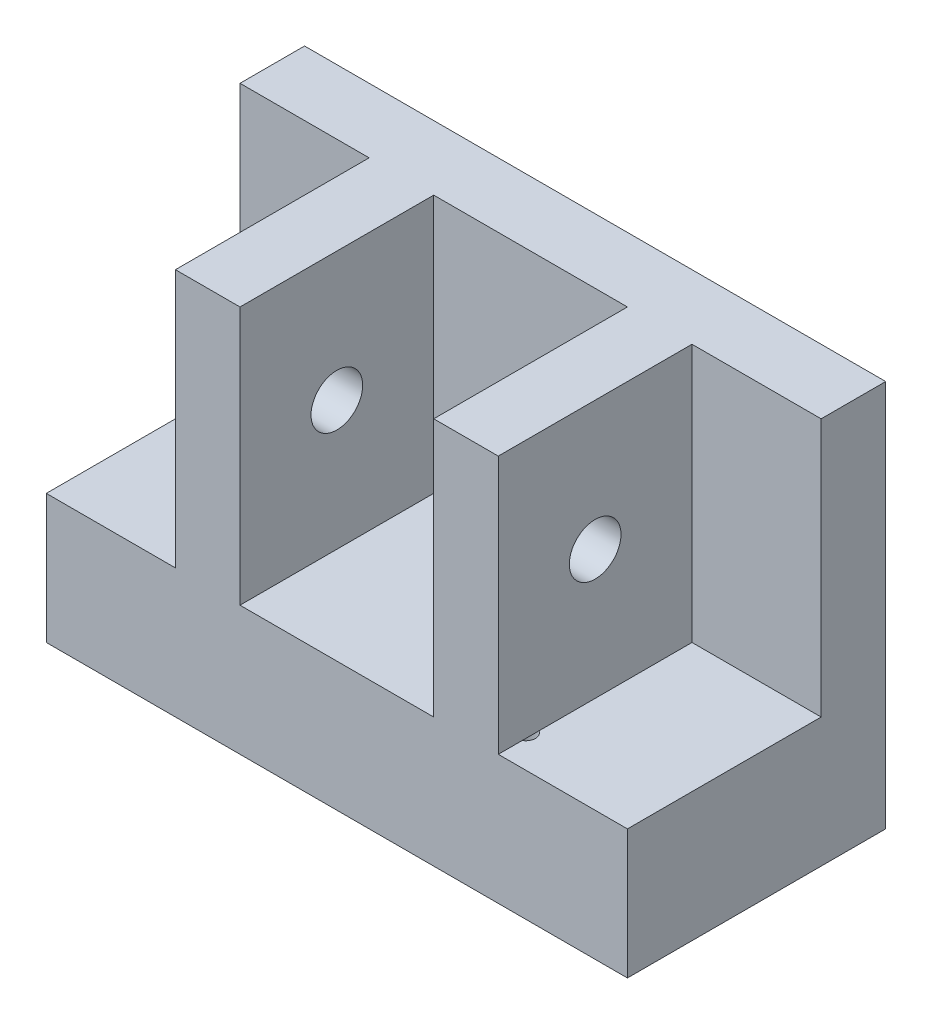
ISO-10303-21;
HEADER;
FILE_DESCRIPTION(('STEP AP214'),'2;1');
FILE_NAME('part.step','',(''),(''),'','','');
FILE_SCHEMA(('AUTOMOTIVE_DESIGN { 1 0 10303 214 1 1 1 1 }'));
ENDSEC;
DATA;
#1=APPLICATION_CONTEXT('core data for automotive mechanical design processes');
#2=APPLICATION_PROTOCOL_DEFINITION('international standard','automotive_design',2000,#1);
#3=PRODUCT_CONTEXT('',#1,'mechanical');
#4=PRODUCT('Part','Part','',(#3));
#5=PRODUCT_RELATED_PRODUCT_CATEGORY('part','',(#4));
#6=PRODUCT_DEFINITION_FORMATION('','',#4);
#7=PRODUCT_DEFINITION_CONTEXT('part definition',#1,'design');
#8=PRODUCT_DEFINITION('design','',#6,#7);
#9=PRODUCT_DEFINITION_SHAPE('','',#8);
#10=(LENGTH_UNIT() NAMED_UNIT(*) SI_UNIT(.MILLI.,.METRE.));
#11=(NAMED_UNIT(*) PLANE_ANGLE_UNIT() SI_UNIT($,.RADIAN.));
#12=(NAMED_UNIT(*) SI_UNIT($,.STERADIAN.) SOLID_ANGLE_UNIT());
#13=UNCERTAINTY_MEASURE_WITH_UNIT(LENGTH_MEASURE(1.E-05),#10,'distance_accuracy_value','');
#14=(GEOMETRIC_REPRESENTATION_CONTEXT(3) GLOBAL_UNCERTAINTY_ASSIGNED_CONTEXT((#13)) GLOBAL_UNIT_ASSIGNED_CONTEXT((#10,
#11,#12)) REPRESENTATION_CONTEXT('',''));
#15=CARTESIAN_POINT('',(0.,0.,0.));
#16=DIRECTION('',(0.,0.,1.));
#17=DIRECTION('',(1.,0.,0.));
#18=AXIS2_PLACEMENT_3D('',#15,#16,#17);
#19=CARTESIAN_POINT('',(0.,40.,-30.));
#20=DIRECTION('',(0.,0.,1.));
#21=DIRECTION('',(1.,0.,0.));
#22=AXIS2_PLACEMENT_3D('',#19,#20,#21);
#23=PLANE('',#22);
#24=DIRECTION('',(-1.,0.,0.));
#25=VECTOR('',#24,1.);
#26=CARTESIAN_POINT('',(0.,0.,-30.));
#27=LINE('',#26,#25);
#28=CARTESIAN_POINT('',(-25.,0.,-30.));
#29=VERTEX_POINT('',#28);
#30=CARTESIAN_POINT('',(-45.,0.,-30.));
#31=VERTEX_POINT('',#30);
#32=EDGE_CURVE('E175',#29,#31,#27,.T.);
#33=ORIENTED_EDGE('',*,*,#32,.F.);
#34=DIRECTION('',(0.,-1.,0.));
#35=VECTOR('',#34,1.);
#36=CARTESIAN_POINT('',(-25.,40.,-30.));
#37=LINE('',#36,#35);
#38=CARTESIAN_POINT('',(-25.,40.,-30.));
#39=VERTEX_POINT('',#38);
#40=EDGE_CURVE('E11',#39,#29,#37,.T.);
#41=ORIENTED_EDGE('',*,*,#40,.F.);
#42=DIRECTION('',(-1.,0.,0.));
#43=VECTOR('',#42,1.);
#44=CARTESIAN_POINT('',(0.,40.,-30.));
#45=LINE('',#44,#43);
#46=CARTESIAN_POINT('',(-45.,40.,-30.));
#47=VERTEX_POINT('',#46);
#48=EDGE_CURVE('E199',#39,#47,#45,.T.);
#49=ORIENTED_EDGE('',*,*,#48,.T.);
#50=DIRECTION('',(0.,-1.,0.));
#51=VECTOR('',#50,1.);
#52=CARTESIAN_POINT('',(-45.,40.,-30.));
#53=LINE('',#52,#51);
#54=EDGE_CURVE('E200',#47,#31,#53,.T.);
#55=ORIENTED_EDGE('',*,*,#54,.T.);
#56=EDGE_LOOP('',(#33,#41,#49,#55));
#57=FACE_BOUND('',#56,.T.);
#58=ADVANCED_FACE('F43',(#57),#23,.T.);
#59=CARTESIAN_POINT('',(-25.,40.,0.));
#60=DIRECTION('',(1.,0.,0.));
#61=DIRECTION('',(0.,0.,-1.));
#62=AXIS2_PLACEMENT_3D('',#59,#60,#61);
#63=PLANE('',#62);
#64=CARTESIAN_POINT('',(-25.,20.,-15.));
#65=DIRECTION('',(1.,0.,0.));
#66=DIRECTION('',(0.,0.,-1.));
#67=AXIS2_PLACEMENT_3D('',#64,#65,#66);
#68=CIRCLE('',#67,4.);
#69=CARTESIAN_POINT('',(-25.,20.,-19.));
#70=VERTEX_POINT('',#69);
#71=EDGE_CURVE('E250',#70,#70,#68,.T.);
#72=ORIENTED_EDGE('',*,*,#71,.T.);
#73=EDGE_LOOP('',(#72));
#74=FACE_BOUND('',#73,.T.);
#75=DIRECTION('',(0.,0.,1.));
#76=VECTOR('',#75,1.);
#77=CARTESIAN_POINT('',(-25.,0.,0.));
#78=LINE('',#77,#76);
#79=CARTESIAN_POINT('',(-25.,0.,-6.29903810567667));
#80=VERTEX_POINT('',#79);
#81=EDGE_CURVE('E177',#29,#80,#78,.T.);
#82=ORIENTED_EDGE('',*,*,#81,.T.);
#83=CARTESIAN_POINT('',(-25.,0.,-3.70096189432335));
#84=VERTEX_POINT('',#83);
#85=EDGE_CURVE('E156',#80,#84,#78,.T.);
#86=ORIENTED_EDGE('',*,*,#85,.T.);
#87=CARTESIAN_POINT('',(-25.,0.,0.));
#88=VERTEX_POINT('',#87);
#89=EDGE_CURVE('E168',#84,#88,#78,.T.);
#90=ORIENTED_EDGE('',*,*,#89,.T.);
#91=DIRECTION('',(0.,-1.,0.));
#92=VECTOR('',#91,1.);
#93=CARTESIAN_POINT('',(-25.,40.,0.));
#94=LINE('',#93,#92);
#95=CARTESIAN_POINT('',(-25.,40.,0.));
#96=VERTEX_POINT('',#95);
#97=EDGE_CURVE('E51',#96,#88,#94,.T.);
#98=ORIENTED_EDGE('',*,*,#97,.F.);
#99=DIRECTION('',(0.,0.,1.));
#100=VECTOR('',#99,1.);
#101=CARTESIAN_POINT('',(-25.,40.,0.));
#102=LINE('',#101,#100);
#103=EDGE_CURVE('E237',#39,#96,#102,.T.);
#104=ORIENTED_EDGE('',*,*,#103,.F.);
#105=ORIENTED_EDGE('',*,*,#40,.T.);
#106=EDGE_LOOP('',(#82,#86,#90,#98,#104,#105));
#107=FACE_BOUND('',#106,.T.);
#108=ADVANCED_FACE('F178',(#74,#107),#63,.F.);
#109=CARTESIAN_POINT('',(-15.,40.,0.));
#110=DIRECTION('',(-1.,0.,0.));
#111=DIRECTION('',(0.,0.,1.));
#112=AXIS2_PLACEMENT_3D('',#109,#110,#111);
#113=PLANE('',#112);
#114=CARTESIAN_POINT('',(-15.,20.,-15.));
#115=DIRECTION('',(-1.,0.,0.));
#116=DIRECTION('',(0.,0.,1.));
#117=AXIS2_PLACEMENT_3D('',#114,#115,#116);
#118=CIRCLE('',#117,4.);
#119=CARTESIAN_POINT('',(-15.,20.,-11.));
#120=VERTEX_POINT('',#119);
#121=EDGE_CURVE('E276',#120,#120,#118,.T.);
#122=ORIENTED_EDGE('',*,*,#121,.T.);
#123=EDGE_LOOP('',(#122));
#124=FACE_BOUND('',#123,.T.);
#125=DIRECTION('',(0.,0.,-1.));
#126=VECTOR('',#125,1.);
#127=CARTESIAN_POINT('',(-15.,0.,0.));
#128=LINE('',#127,#126);
#129=CARTESIAN_POINT('',(-15.,0.,0.));
#130=VERTEX_POINT('',#129);
#131=CARTESIAN_POINT('',(-15.,0.,-30.));
#132=VERTEX_POINT('',#131);
#133=EDGE_CURVE('E179',#130,#132,#128,.T.);
#134=ORIENTED_EDGE('',*,*,#133,.T.);
#135=DIRECTION('',(0.,-1.,0.));
#136=VECTOR('',#135,1.);
#137=CARTESIAN_POINT('',(-15.,40.,-30.));
#138=LINE('',#137,#136);
#139=CARTESIAN_POINT('',(-15.,40.,-30.));
#140=VERTEX_POINT('',#139);
#141=EDGE_CURVE('E223',#140,#132,#138,.T.);
#142=ORIENTED_EDGE('',*,*,#141,.F.);
#143=DIRECTION('',(0.,0.,-1.));
#144=VECTOR('',#143,1.);
#145=CARTESIAN_POINT('',(-15.,40.,0.));
#146=LINE('',#145,#144);
#147=CARTESIAN_POINT('',(-15.,40.,0.));
#148=VERTEX_POINT('',#147);
#149=EDGE_CURVE('E254',#148,#140,#146,.T.);
#150=ORIENTED_EDGE('',*,*,#149,.F.);
#151=DIRECTION('',(0.,-1.,0.));
#152=VECTOR('',#151,1.);
#153=CARTESIAN_POINT('',(-15.,40.,0.));
#154=LINE('',#153,#152);
#155=EDGE_CURVE('E226',#148,#130,#154,.T.);
#156=ORIENTED_EDGE('',*,*,#155,.T.);
#157=EDGE_LOOP('',(#134,#142,#150,#156));
#158=FACE_BOUND('',#157,.T.);
#159=ADVANCED_FACE('F353',(#124,#158),#113,.F.);
#160=CARTESIAN_POINT('',(0.,40.,-30.));
#161=DIRECTION('',(0.,0.,-1.));
#162=DIRECTION('',(-1.,0.,0.));
#163=AXIS2_PLACEMENT_3D('',#160,#161,#162);
#164=PLANE('',#163);
#165=DIRECTION('',(1.,0.,0.));
#166=VECTOR('',#165,1.);
#167=CARTESIAN_POINT('',(0.,0.,-30.));
#168=LINE('',#167,#166);
#169=CARTESIAN_POINT('',(15.,0.,-30.));
#170=VERTEX_POINT('',#169);
#171=EDGE_CURVE('E185',#132,#170,#168,.T.);
#172=ORIENTED_EDGE('',*,*,#171,.T.);
#173=DIRECTION('',(0.,-1.,0.));
#174=VECTOR('',#173,1.);
#175=CARTESIAN_POINT('',(15.,40.,-30.));
#176=LINE('',#175,#174);
#177=CARTESIAN_POINT('',(15.,40.,-30.));
#178=VERTEX_POINT('',#177);
#179=EDGE_CURVE('E220',#178,#170,#176,.T.);
#180=ORIENTED_EDGE('',*,*,#179,.F.);
#181=DIRECTION('',(1.,0.,0.));
#182=VECTOR('',#181,1.);
#183=CARTESIAN_POINT('',(0.,40.,-30.));
#184=LINE('',#183,#182);
#185=EDGE_CURVE('E256',#140,#178,#184,.T.);
#186=ORIENTED_EDGE('',*,*,#185,.F.);
#187=ORIENTED_EDGE('',*,*,#141,.T.);
#188=EDGE_LOOP('',(#172,#180,#186,#187));
#189=FACE_BOUND('',#188,.T.);
#190=ADVANCED_FACE('F349',(#189),#164,.F.);
#191=CARTESIAN_POINT('',(15.,40.,0.));
#192=DIRECTION('',(1.,0.,0.));
#193=DIRECTION('',(0.,0.,-1.));
#194=AXIS2_PLACEMENT_3D('',#191,#192,#193);
#195=PLANE('',#194);
#196=CARTESIAN_POINT('',(15.,20.,-15.));
#197=DIRECTION('',(1.,0.,0.));
#198=DIRECTION('',(0.,0.,-1.));
#199=AXIS2_PLACEMENT_3D('',#196,#197,#198);
#200=CIRCLE('',#199,4.);
#201=CARTESIAN_POINT('',(15.,20.,-19.));
#202=VERTEX_POINT('',#201);
#203=EDGE_CURVE('E280',#202,#202,#200,.T.);
#204=ORIENTED_EDGE('',*,*,#203,.T.);
#205=EDGE_LOOP('',(#204));
#206=FACE_BOUND('',#205,.T.);
#207=DIRECTION('',(0.,0.,1.));
#208=VECTOR('',#207,1.);
#209=CARTESIAN_POINT('',(15.,0.,0.));
#210=LINE('',#209,#208);
#211=CARTESIAN_POINT('',(15.,0.,0.));
#212=VERTEX_POINT('',#211);
#213=EDGE_CURVE('E188',#170,#212,#210,.T.);
#214=ORIENTED_EDGE('',*,*,#213,.T.);
#215=DIRECTION('',(0.,-1.,0.));
#216=VECTOR('',#215,1.);
#217=CARTESIAN_POINT('',(15.,40.,0.));
#218=LINE('',#217,#216);
#219=CARTESIAN_POINT('',(15.,40.,0.));
#220=VERTEX_POINT('',#219);
#221=EDGE_CURVE('E217',#220,#212,#218,.T.);
#222=ORIENTED_EDGE('',*,*,#221,.F.);
#223=DIRECTION('',(0.,0.,1.));
#224=VECTOR('',#223,1.);
#225=CARTESIAN_POINT('',(15.,40.,0.));
#226=LINE('',#225,#224);
#227=EDGE_CURVE('E258',#178,#220,#226,.T.);
#228=ORIENTED_EDGE('',*,*,#227,.F.);
#229=ORIENTED_EDGE('',*,*,#179,.T.);
#230=EDGE_LOOP('',(#214,#222,#228,#229));
#231=FACE_BOUND('',#230,.T.);
#232=ADVANCED_FACE('F346',(#206,#231),#195,.F.);
#233=CARTESIAN_POINT('',(0.,40.,0.));
#234=DIRECTION('',(0.,0.,-1.));
#235=DIRECTION('',(-1.,0.,0.));
#236=AXIS2_PLACEMENT_3D('',#233,#234,#235);
#237=PLANE('',#236);
#238=ORIENTED_EDGE('',*,*,#221,.T.);
#239=DIRECTION('',(-1.,0.,0.));
#240=VECTOR('',#239,1.);
#241=CARTESIAN_POINT('',(-45.,0.,0.));
#242=LINE('',#241,#240);
#243=EDGE_CURVE('E296',#212,#130,#242,.T.);
#244=ORIENTED_EDGE('',*,*,#243,.T.);
#245=ORIENTED_EDGE('',*,*,#155,.F.);
#246=DIRECTION('',(1.,0.,0.));
#247=VECTOR('',#246,1.);
#248=CARTESIAN_POINT('',(0.,40.,0.));
#249=LINE('',#248,#247);
#250=EDGE_CURVE('E235',#96,#148,#249,.T.);
#251=ORIENTED_EDGE('',*,*,#250,.F.);
#252=ORIENTED_EDGE('',*,*,#97,.T.);
#253=CARTESIAN_POINT('',(-45.,0.,0.));
#254=VERTEX_POINT('',#253);
#255=EDGE_CURVE('E171',#88,#254,#242,.T.);
#256=ORIENTED_EDGE('',*,*,#255,.T.);
#257=DIRECTION('',(0.,1.,0.));
#258=VECTOR('',#257,1.);
#259=CARTESIAN_POINT('',(-45.,-20.,0.));
#260=LINE('',#259,#258);
#261=CARTESIAN_POINT('',(-45.,-20.,0.));
#262=VERTEX_POINT('',#261);
#263=EDGE_CURVE('E289',#262,#254,#260,.T.);
#264=ORIENTED_EDGE('',*,*,#263,.F.);
#265=DIRECTION('',(-1.,0.,0.));
#266=VECTOR('',#265,1.);
#267=CARTESIAN_POINT('',(-45.,-20.,0.));
#268=LINE('',#267,#266);
#269=CARTESIAN_POINT('',(45.,-20.,0.));
#270=VERTEX_POINT('',#269);
#271=EDGE_CURVE('E291',#270,#262,#268,.T.);
#272=ORIENTED_EDGE('',*,*,#271,.F.);
#273=DIRECTION('',(0.,1.,0.));
#274=VECTOR('',#273,1.);
#275=CARTESIAN_POINT('',(45.,-20.,0.));
#276=LINE('',#275,#274);
#277=CARTESIAN_POINT('',(45.,0.,0.));
#278=VERTEX_POINT('',#277);
#279=EDGE_CURVE('E286',#270,#278,#276,.T.);
#280=ORIENTED_EDGE('',*,*,#279,.T.);
#281=CARTESIAN_POINT('',(25.,0.,0.));
#282=VERTEX_POINT('',#281);
#283=EDGE_CURVE('E292',#278,#282,#242,.T.);
#284=ORIENTED_EDGE('',*,*,#283,.T.);
#285=DIRECTION('',(0.,-1.,0.));
#286=VECTOR('',#285,1.);
#287=CARTESIAN_POINT('',(25.,40.,0.));
#288=LINE('',#287,#286);
#289=CARTESIAN_POINT('',(25.,40.,0.));
#290=VERTEX_POINT('',#289);
#291=EDGE_CURVE('E214',#290,#282,#288,.T.);
#292=ORIENTED_EDGE('',*,*,#291,.F.);
#293=DIRECTION('',(1.,0.,0.));
#294=VECTOR('',#293,1.);
#295=CARTESIAN_POINT('',(0.,40.,0.));
#296=LINE('',#295,#294);
#297=EDGE_CURVE('E260',#220,#290,#296,.T.);
#298=ORIENTED_EDGE('',*,*,#297,.F.);
#299=EDGE_LOOP('',(#238,#244,#245,#251,#252,#256,#264,#272,#280,#284,#292,#298));
#300=FACE_BOUND('',#299,.T.);
#301=ADVANCED_FACE('F231',(#300),#237,.F.);
#302=CARTESIAN_POINT('',(25.,40.,0.));
#303=DIRECTION('',(-1.,0.,0.));
#304=DIRECTION('',(0.,0.,1.));
#305=AXIS2_PLACEMENT_3D('',#302,#303,#304);
#306=PLANE('',#305);
#307=CARTESIAN_POINT('',(25.,20.,-15.));
#308=DIRECTION('',(-1.,0.,0.));
#309=DIRECTION('',(0.,0.,1.));
#310=AXIS2_PLACEMENT_3D('',#307,#308,#309);
#311=CIRCLE('',#310,4.);
#312=CARTESIAN_POINT('',(25.,20.,-11.));
#313=VERTEX_POINT('',#312);
#314=EDGE_CURVE('E46',#313,#313,#311,.T.);
#315=ORIENTED_EDGE('',*,*,#314,.T.);
#316=EDGE_LOOP('',(#315));
#317=FACE_BOUND('',#316,.T.);
#318=DIRECTION('',(0.,0.,-1.));
#319=VECTOR('',#318,1.);
#320=CARTESIAN_POINT('',(25.,0.,0.));
#321=LINE('',#320,#319);
#322=CARTESIAN_POINT('',(25.,0.,-3.70096189432335));
#323=VERTEX_POINT('',#322);
#324=EDGE_CURVE('E192',#282,#323,#321,.T.);
#325=ORIENTED_EDGE('',*,*,#324,.T.);
#326=CARTESIAN_POINT('',(25.,0.,-6.29903810567666));
#327=VERTEX_POINT('',#326);
#328=EDGE_CURVE('E196',#323,#327,#321,.T.);
#329=ORIENTED_EDGE('',*,*,#328,.T.);
#330=CARTESIAN_POINT('',(25.,0.,-30.));
#331=VERTEX_POINT('',#330);
#332=EDGE_CURVE('E191',#327,#331,#321,.T.);
#333=ORIENTED_EDGE('',*,*,#332,.T.);
#334=DIRECTION('',(0.,-1.,0.));
#335=VECTOR('',#334,1.);
#336=CARTESIAN_POINT('',(25.,40.,-30.));
#337=LINE('',#336,#335);
#338=CARTESIAN_POINT('',(25.,40.,-30.));
#339=VERTEX_POINT('',#338);
#340=EDGE_CURVE('E211',#339,#331,#337,.T.);
#341=ORIENTED_EDGE('',*,*,#340,.F.);
#342=DIRECTION('',(0.,0.,-1.));
#343=VECTOR('',#342,1.);
#344=CARTESIAN_POINT('',(25.,40.,0.));
#345=LINE('',#344,#343);
#346=EDGE_CURVE('E262',#290,#339,#345,.T.);
#347=ORIENTED_EDGE('',*,*,#346,.F.);
#348=ORIENTED_EDGE('',*,*,#291,.T.);
#349=EDGE_LOOP('',(#325,#329,#333,#341,#347,#348));
#350=FACE_BOUND('',#349,.T.);
#351=ADVANCED_FACE('F336',(#317,#350),#306,.F.);
#352=CARTESIAN_POINT('',(0.,40.,-30.));
#353=DIRECTION('',(0.,0.,-1.));
#354=DIRECTION('',(-1.,0.,0.));
#355=AXIS2_PLACEMENT_3D('',#352,#353,#354);
#356=PLANE('',#355);
#357=DIRECTION('',(1.,0.,0.));
#358=VECTOR('',#357,1.);
#359=CARTESIAN_POINT('',(0.,0.,-30.));
#360=LINE('',#359,#358);
#361=CARTESIAN_POINT('',(45.,0.,-30.));
#362=VERTEX_POINT('',#361);
#363=EDGE_CURVE('E195',#331,#362,#360,.T.);
#364=ORIENTED_EDGE('',*,*,#363,.T.);
#365=DIRECTION('',(0.,-1.,0.));
#366=VECTOR('',#365,1.);
#367=CARTESIAN_POINT('',(45.,40.,-30.));
#368=LINE('',#367,#366);
#369=CARTESIAN_POINT('',(45.,40.,-30.));
#370=VERTEX_POINT('',#369);
#371=EDGE_CURVE('E208',#370,#362,#368,.T.);
#372=ORIENTED_EDGE('',*,*,#371,.F.);
#373=DIRECTION('',(1.,0.,0.));
#374=VECTOR('',#373,1.);
#375=CARTESIAN_POINT('',(0.,40.,-30.));
#376=LINE('',#375,#374);
#377=EDGE_CURVE('E264',#339,#370,#376,.T.);
#378=ORIENTED_EDGE('',*,*,#377,.F.);
#379=ORIENTED_EDGE('',*,*,#340,.T.);
#380=EDGE_LOOP('',(#364,#372,#378,#379));
#381=FACE_BOUND('',#380,.T.);
#382=ADVANCED_FACE('F437',(#381),#356,.F.);
#383=CARTESIAN_POINT('',(45.,40.,0.));
#384=DIRECTION('',(-1.,0.,0.));
#385=DIRECTION('',(0.,0.,1.));
#386=AXIS2_PLACEMENT_3D('',#383,#384,#385);
#387=PLANE('',#386);
#388=ORIENTED_EDGE('',*,*,#371,.T.);
#389=DIRECTION('',(0.,0.,1.));
#390=VECTOR('',#389,1.);
#391=CARTESIAN_POINT('',(45.,0.,-40.));
#392=LINE('',#391,#390);
#393=EDGE_CURVE('E297',#362,#278,#392,.T.);
#394=ORIENTED_EDGE('',*,*,#393,.T.);
#395=ORIENTED_EDGE('',*,*,#279,.F.);
#396=DIRECTION('',(0.,0.,1.));
#397=VECTOR('',#396,1.);
#398=CARTESIAN_POINT('',(45.,-20.,-40.));
#399=LINE('',#398,#397);
#400=CARTESIAN_POINT('',(45.,-20.,-40.));
#401=VERTEX_POINT('',#400);
#402=EDGE_CURVE('E301',#401,#270,#399,.T.);
#403=ORIENTED_EDGE('',*,*,#402,.F.);
#404=DIRECTION('',(0.,-1.,0.));
#405=VECTOR('',#404,1.);
#406=CARTESIAN_POINT('',(45.,40.,-40.));
#407=LINE('',#406,#405);
#408=CARTESIAN_POINT('',(45.,40.,-40.));
#409=VERTEX_POINT('',#408);
#410=EDGE_CURVE('E206',#409,#401,#407,.T.);
#411=ORIENTED_EDGE('',*,*,#410,.F.);
#412=DIRECTION('',(0.,0.,-1.));
#413=VECTOR('',#412,1.);
#414=CARTESIAN_POINT('',(45.,40.,0.));
#415=LINE('',#414,#413);
#416=EDGE_CURVE('E266',#370,#409,#415,.T.);
#417=ORIENTED_EDGE('',*,*,#416,.F.);
#418=EDGE_LOOP('',(#388,#394,#395,#403,#411,#417));
#419=FACE_BOUND('',#418,.T.);
#420=ADVANCED_FACE('F422',(#419),#387,.F.);
#421=CARTESIAN_POINT('',(0.,40.,-40.));
#422=DIRECTION('',(0.,0.,-1.));
#423=DIRECTION('',(-1.,0.,0.));
#424=AXIS2_PLACEMENT_3D('',#421,#422,#423);
#425=PLANE('',#424);
#426=ORIENTED_EDGE('',*,*,#410,.T.);
#427=DIRECTION('',(1.,0.,0.));
#428=VECTOR('',#427,1.);
#429=CARTESIAN_POINT('',(-45.,-20.,-40.));
#430=LINE('',#429,#428);
#431=CARTESIAN_POINT('',(-45.,-20.,-40.));
#432=VERTEX_POINT('',#431);
#433=EDGE_CURVE('E303',#432,#401,#430,.T.);
#434=ORIENTED_EDGE('',*,*,#433,.F.);
#435=DIRECTION('',(0.,-1.,0.));
#436=VECTOR('',#435,1.);
#437=CARTESIAN_POINT('',(-45.,40.,-40.));
#438=LINE('',#437,#436);
#439=CARTESIAN_POINT('',(-45.,40.,-40.));
#440=VERTEX_POINT('',#439);
#441=EDGE_CURVE('E203',#440,#432,#438,.T.);
#442=ORIENTED_EDGE('',*,*,#441,.F.);
#443=DIRECTION('',(1.,0.,0.));
#444=VECTOR('',#443,1.);
#445=CARTESIAN_POINT('',(0.,40.,-40.));
#446=LINE('',#445,#444);
#447=EDGE_CURVE('E268',#440,#409,#446,.T.);
#448=ORIENTED_EDGE('',*,*,#447,.T.);
#449=EDGE_LOOP('',(#426,#434,#442,#448));
#450=FACE_BOUND('',#449,.T.);
#451=ADVANCED_FACE('F410',(#450),#425,.T.);
#452=CARTESIAN_POINT('',(-45.,40.,0.));
#453=DIRECTION('',(-1.,0.,0.));
#454=DIRECTION('',(0.,0.,1.));
#455=AXIS2_PLACEMENT_3D('',#452,#453,#454);
#456=PLANE('',#455);
#457=ORIENTED_EDGE('',*,*,#441,.T.);
#458=DIRECTION('',(0.,0.,-1.));
#459=VECTOR('',#458,1.);
#460=CARTESIAN_POINT('',(-45.,-20.,-40.));
#461=LINE('',#460,#459);
#462=EDGE_CURVE('E295',#262,#432,#461,.T.);
#463=ORIENTED_EDGE('',*,*,#462,.F.);
#464=ORIENTED_EDGE('',*,*,#263,.T.);
#465=DIRECTION('',(0.,0.,-1.));
#466=VECTOR('',#465,1.);
#467=CARTESIAN_POINT('',(-45.,0.,-40.));
#468=LINE('',#467,#466);
#469=EDGE_CURVE('E166',#254,#31,#468,.T.);
#470=ORIENTED_EDGE('',*,*,#469,.T.);
#471=ORIENTED_EDGE('',*,*,#54,.F.);
#472=DIRECTION('',(0.,0.,-1.));
#473=VECTOR('',#472,1.);
#474=CARTESIAN_POINT('',(-45.,40.,0.));
#475=LINE('',#474,#473);
#476=EDGE_CURVE('E204',#47,#440,#475,.T.);
#477=ORIENTED_EDGE('',*,*,#476,.T.);
#478=EDGE_LOOP('',(#457,#463,#464,#470,#471,#477));
#479=FACE_BOUND('',#478,.T.);
#480=ADVANCED_FACE('F271',(#479),#456,.T.);
#481=CARTESIAN_POINT('',(0.,40.,0.));
#482=DIRECTION('',(0.,1.,0.));
#483=DIRECTION('',(0.,0.,1.));
#484=AXIS2_PLACEMENT_3D('',#481,#482,#483);
#485=PLANE('',#484);
#486=ORIENTED_EDGE('',*,*,#48,.F.);
#487=ORIENTED_EDGE('',*,*,#103,.T.);
#488=ORIENTED_EDGE('',*,*,#250,.T.);
#489=ORIENTED_EDGE('',*,*,#149,.T.);
#490=ORIENTED_EDGE('',*,*,#185,.T.);
#491=ORIENTED_EDGE('',*,*,#227,.T.);
#492=ORIENTED_EDGE('',*,*,#297,.T.);
#493=ORIENTED_EDGE('',*,*,#346,.T.);
#494=ORIENTED_EDGE('',*,*,#377,.T.);
#495=ORIENTED_EDGE('',*,*,#416,.T.);
#496=ORIENTED_EDGE('',*,*,#447,.F.);
#497=ORIENTED_EDGE('',*,*,#476,.F.);
#498=EDGE_LOOP('',(#486,#487,#488,#489,#490,#491,#492,#493,#494,#495,#496,#497));
#499=FACE_BOUND('',#498,.T.);
#500=ADVANCED_FACE('F244',(#499),#485,.T.);
#501=CARTESIAN_POINT('',(-45.,20.,-15.));
#502=DIRECTION('',(1.,0.,0.));
#503=DIRECTION('',(0.,0.,-1.));
#504=AXIS2_PLACEMENT_3D('',#501,#502,#503);
#505=CYLINDRICAL_SURFACE('',#504,4.);
#506=ORIENTED_EDGE('',*,*,#314,.F.);
#507=EDGE_LOOP('',(#506));
#508=FACE_BOUND('',#507,.T.);
#509=ORIENTED_EDGE('',*,*,#203,.F.);
#510=EDGE_LOOP('',(#509));
#511=FACE_BOUND('',#510,.T.);
#512=ADVANCED_FACE('F373',(#508,#511),#505,.F.);
#513=ORIENTED_EDGE('',*,*,#121,.F.);
#514=EDGE_LOOP('',(#513));
#515=FACE_BOUND('',#514,.T.);
#516=ORIENTED_EDGE('',*,*,#71,.F.);
#517=EDGE_LOOP('',(#516));
#518=FACE_BOUND('',#517,.T.);
#519=ADVANCED_FACE('F369',(#515,#518),#505,.F.);
#520=CARTESIAN_POINT('',(0.,0.,0.));
#521=DIRECTION('',(0.,1.,0.));
#522=DIRECTION('',(0.,0.,1.));
#523=AXIS2_PLACEMENT_3D('',#520,#521,#522);
#524=PLANE('',#523);
#525=CARTESIAN_POINT('',(24.25,0.,-5.));
#526=DIRECTION('',(0.,-1.,0.));
#527=DIRECTION('',(0.,0.,-1.));
#528=AXIS2_PLACEMENT_3D('',#525,#526,#527);
#529=CIRCLE('',#528,1.5);
#530=EDGE_CURVE('E308',#327,#323,#529,.T.);
#531=ORIENTED_EDGE('',*,*,#530,.T.);
#532=ORIENTED_EDGE('',*,*,#324,.F.);
#533=ORIENTED_EDGE('',*,*,#283,.F.);
#534=ORIENTED_EDGE('',*,*,#393,.F.);
#535=ORIENTED_EDGE('',*,*,#363,.F.);
#536=ORIENTED_EDGE('',*,*,#332,.F.);
#537=EDGE_LOOP('',(#531,#532,#533,#534,#535,#536));
#538=FACE_BOUND('',#537,.T.);
#539=ADVANCED_FACE('F331',(#538),#524,.T.);
#540=ORIENTED_EDGE('',*,*,#213,.F.);
#541=ORIENTED_EDGE('',*,*,#171,.F.);
#542=ORIENTED_EDGE('',*,*,#133,.F.);
#543=ORIENTED_EDGE('',*,*,#243,.F.);
#544=EDGE_LOOP('',(#540,#541,#542,#543));
#545=FACE_BOUND('',#544,.T.);
#546=ADVANCED_FACE('F320',(#545),#524,.T.);
#547=CARTESIAN_POINT('',(0.,-20.,0.));
#548=DIRECTION('',(0.,1.,0.));
#549=DIRECTION('',(0.,0.,1.));
#550=AXIS2_PLACEMENT_3D('',#547,#548,#549);
#551=PLANE('',#550);
#552=CARTESIAN_POINT('',(-24.25,-20.,-5.00000000000001));
#553=DIRECTION('',(0.,-1.,0.));
#554=DIRECTION('',(0.,0.,-1.));
#555=AXIS2_PLACEMENT_3D('',#552,#553,#554);
#556=CIRCLE('',#555,1.5);
#557=CARTESIAN_POINT('',(-24.25,-20.,-6.50000000000001));
#558=VERTEX_POINT('',#557);
#559=EDGE_CURVE('E159',#558,#558,#556,.T.);
#560=ORIENTED_EDGE('',*,*,#559,.F.);
#561=EDGE_LOOP('',(#560));
#562=FACE_BOUND('',#561,.T.);
#563=CARTESIAN_POINT('',(24.25,-20.,-5.));
#564=DIRECTION('',(0.,-1.,0.));
#565=DIRECTION('',(0.,0.,-1.));
#566=AXIS2_PLACEMENT_3D('',#563,#564,#565);
#567=CIRCLE('',#566,1.5);
#568=CARTESIAN_POINT('',(24.25,-20.,-6.50000000000001));
#569=VERTEX_POINT('',#568);
#570=EDGE_CURVE('E311',#569,#569,#567,.T.);
#571=ORIENTED_EDGE('',*,*,#570,.F.);
#572=EDGE_LOOP('',(#571));
#573=FACE_BOUND('',#572,.T.);
#574=ORIENTED_EDGE('',*,*,#462,.T.);
#575=ORIENTED_EDGE('',*,*,#433,.T.);
#576=ORIENTED_EDGE('',*,*,#402,.T.);
#577=ORIENTED_EDGE('',*,*,#271,.T.);
#578=EDGE_LOOP('',(#574,#575,#576,#577));
#579=FACE_BOUND('',#578,.T.);
#580=ADVANCED_FACE('F317',(#562,#573,#579),#551,.F.);
#581=CARTESIAN_POINT('',(-24.25,0.,-5.00000000000001));
#582=DIRECTION('',(0.,-1.,0.));
#583=DIRECTION('',(0.,0.,-1.));
#584=AXIS2_PLACEMENT_3D('',#581,#582,#583);
#585=CIRCLE('',#584,1.5);
#586=EDGE_CURVE('E158',#84,#80,#585,.T.);
#587=ORIENTED_EDGE('',*,*,#586,.T.);
#588=ORIENTED_EDGE('',*,*,#81,.F.);
#589=ORIENTED_EDGE('',*,*,#32,.T.);
#590=ORIENTED_EDGE('',*,*,#469,.F.);
#591=ORIENTED_EDGE('',*,*,#255,.F.);
#592=ORIENTED_EDGE('',*,*,#89,.F.);
#593=EDGE_LOOP('',(#587,#588,#589,#590,#591,#592));
#594=FACE_BOUND('',#593,.T.);
#595=ADVANCED_FACE('F169',(#594),#524,.T.);
#596=CARTESIAN_POINT('',(-24.25,0.,-5.00000000000001));
#597=DIRECTION('',(0.,-1.,0.));
#598=DIRECTION('',(0.,0.,-1.));
#599=AXIS2_PLACEMENT_3D('',#596,#597,#598);
#600=PLANE('',#599);
#601=ORIENTED_EDGE('',*,*,#85,.F.);
#602=EDGE_CURVE('E64',#80,#84,#585,.T.);
#603=ORIENTED_EDGE('',*,*,#602,.T.);
#604=EDGE_LOOP('',(#601,#603));
#605=FACE_BOUND('',#604,.T.);
#606=ADVANCED_FACE('F154',(#605),#600,.T.);
#607=CARTESIAN_POINT('',(-24.25,0.,-5.00000000000001));
#608=DIRECTION('',(0.,-1.,0.));
#609=DIRECTION('',(0.,0.,-1.));
#610=AXIS2_PLACEMENT_3D('',#607,#608,#609);
#611=CYLINDRICAL_SURFACE('',#610,1.5);
#612=ORIENTED_EDGE('',*,*,#586,.F.);
#613=ORIENTED_EDGE('',*,*,#602,.F.);
#614=EDGE_LOOP('',(#612,#613));
#615=FACE_BOUND('',#614,.T.);
#616=ORIENTED_EDGE('',*,*,#559,.T.);
#617=EDGE_LOOP('',(#616));
#618=FACE_BOUND('',#617,.T.);
#619=ADVANCED_FACE('F162',(#615,#618),#611,.F.);
#620=CARTESIAN_POINT('',(24.25,0.,-5.));
#621=DIRECTION('',(0.,-1.,0.));
#622=DIRECTION('',(0.,0.,-1.));
#623=AXIS2_PLACEMENT_3D('',#620,#621,#622);
#624=PLANE('',#623);
#625=ORIENTED_EDGE('',*,*,#328,.F.);
#626=EDGE_CURVE('E57',#323,#327,#529,.T.);
#627=ORIENTED_EDGE('',*,*,#626,.T.);
#628=EDGE_LOOP('',(#625,#627));
#629=FACE_BOUND('',#628,.T.);
#630=ADVANCED_FACE('F537',(#629),#624,.T.);
#631=CARTESIAN_POINT('',(24.25,0.,-5.));
#632=DIRECTION('',(0.,-1.,0.));
#633=DIRECTION('',(0.,0.,-1.));
#634=AXIS2_PLACEMENT_3D('',#631,#632,#633);
#635=CYLINDRICAL_SURFACE('',#634,1.5);
#636=ORIENTED_EDGE('',*,*,#530,.F.);
#637=ORIENTED_EDGE('',*,*,#626,.F.);
#638=EDGE_LOOP('',(#636,#637));
#639=FACE_BOUND('',#638,.T.);
#640=ORIENTED_EDGE('',*,*,#570,.T.);
#641=EDGE_LOOP('',(#640));
#642=FACE_BOUND('',#641,.T.);
#643=ADVANCED_FACE('F546',(#639,#642),#635,.F.);
#644=CLOSED_SHELL('',(#58,#108,#159,#190,#232,#301,#351,#382,#420,#451,#480,#500,#512,#519,#539,
#546,#580,#595,#606,#619,#630,#643));
#645=MANIFOLD_SOLID_BREP('B2',#644);
#646=ADVANCED_BREP_SHAPE_REPRESENTATION('',(#18,#645),#14);
#647=SHAPE_DEFINITION_REPRESENTATION(#9,#646);
ENDSEC;
END-ISO-10303-21;
